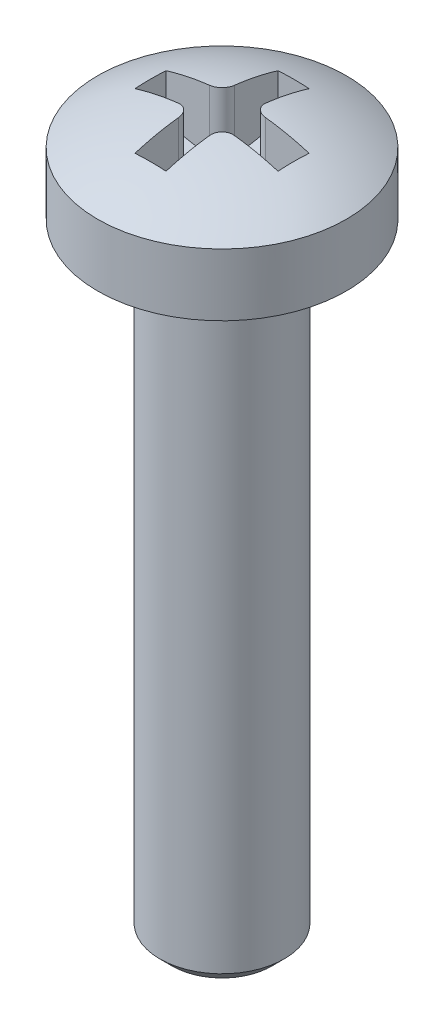
ISO-10303-21;
HEADER;
FILE_DESCRIPTION(('STEP AP214'),'2;1');
FILE_NAME('part.step','',(''),(''),'','','');
FILE_SCHEMA(('AUTOMOTIVE_DESIGN { 1 0 10303 214 1 1 1 1 }'));
ENDSEC;
DATA;
#1=APPLICATION_CONTEXT('core data for automotive mechanical design processes');
#2=APPLICATION_PROTOCOL_DEFINITION('international standard','automotive_design',2000,#1);
#3=PRODUCT_CONTEXT('',#1,'mechanical');
#4=PRODUCT('Part','Part','',(#3));
#5=PRODUCT_RELATED_PRODUCT_CATEGORY('part','',(#4));
#6=PRODUCT_DEFINITION_FORMATION('','',#4);
#7=PRODUCT_DEFINITION_CONTEXT('part definition',#1,'design');
#8=PRODUCT_DEFINITION('design','',#6,#7);
#9=PRODUCT_DEFINITION_SHAPE('','',#8);
#10=(LENGTH_UNIT() NAMED_UNIT(*) SI_UNIT(.MILLI.,.METRE.));
#11=(NAMED_UNIT(*) PLANE_ANGLE_UNIT() SI_UNIT($,.RADIAN.));
#12=(NAMED_UNIT(*) SI_UNIT($,.STERADIAN.) SOLID_ANGLE_UNIT());
#13=UNCERTAINTY_MEASURE_WITH_UNIT(LENGTH_MEASURE(1.E-05),#10,'distance_accuracy_value','');
#14=(GEOMETRIC_REPRESENTATION_CONTEXT(3) GLOBAL_UNCERTAINTY_ASSIGNED_CONTEXT((#13)) GLOBAL_UNIT_ASSIGNED_CONTEXT((#10,
#11,#12)) REPRESENTATION_CONTEXT('',''));
#15=CARTESIAN_POINT('',(0.,0.,0.));
#16=DIRECTION('',(0.,0.,1.));
#17=DIRECTION('',(1.,0.,0.));
#18=AXIS2_PLACEMENT_3D('',#15,#16,#17);
#19=CARTESIAN_POINT('',(2.,-20.,0.));
#20=DIRECTION('',(0.,1.,0.));
#21=DIRECTION('',(0.,0.,1.));
#22=AXIS2_PLACEMENT_3D('',#19,#20,#21);
#23=PLANE('',#22);
#24=CARTESIAN_POINT('',(0.,-20.,0.));
#25=DIRECTION('',(0.,1.,0.));
#26=DIRECTION('',(0.,0.,1.));
#27=AXIS2_PLACEMENT_3D('',#24,#25,#26);
#28=CIRCLE('',#27,1.6);
#29=CARTESIAN_POINT('',(0.,-20.,1.6));
#30=VERTEX_POINT('',#29);
#31=EDGE_CURVE('E11',#30,#30,#28,.F.);
#32=ORIENTED_EDGE('',*,*,#31,.T.);
#33=EDGE_LOOP('',(#32));
#34=FACE_BOUND('',#33,.T.);
#35=ADVANCED_FACE('F37',(#34),#23,.F.);
#36=CARTESIAN_POINT('',(0.,-4.72272727272728,0.));
#37=DIRECTION('',(0.,1.,0.));
#38=DIRECTION('',(1.,0.,0.));
#39=AXIS2_PLACEMENT_3D('',#36,#37,#38);
#40=SPHERICAL_SURFACE('',#39,7.82272727272728);
#41=CARTESIAN_POINT('',(0.5,-4.72272727272728,0.));
#42=DIRECTION('',(1.,0.,0.));
#43=DIRECTION('',(0.,0.,-1.));
#44=AXIS2_PLACEMENT_3D('',#41,#42,#43);
#45=CIRCLE('',#44,7.80673183755348);
#46=CARTESIAN_POINT('',(0.5,2.73750476008987,-2.3));
#47=VERTEX_POINT('',#46);
#48=CARTESIAN_POINT('',(0.5,3.03195273249996,-0.9));
#49=VERTEX_POINT('',#48);
#50=EDGE_CURVE('E195',#47,#49,#45,.T.);
#51=ORIENTED_EDGE('',*,*,#50,.T.);
#52=CARTESIAN_POINT('',(0.5,3.03195273249996,-0.9));
#53=CARTESIAN_POINT('',(0.499980445653111,3.03454133641409,-0.877715199489853));
#54=CARTESIAN_POINT('',(0.501861325410847,3.0369109081898,-0.855406290685576));
#55=CARTESIAN_POINT('',(0.509308944557218,3.04115309750786,-0.811373363194762));
#56=CARTESIAN_POINT('',(0.514874142284133,3.04302592244948,-0.789649103823202));
#57=CARTESIAN_POINT('',(0.529581237998282,3.04621922226135,-0.747382590966706));
#58=CARTESIAN_POINT('',(0.538725894104163,3.0475392695665,-0.726841263013532));
#59=CARTESIAN_POINT('',(0.560335395409864,3.04958563422558,-0.687561895208892));
#60=CARTESIAN_POINT('',(0.572799188800053,3.05031213937239,-0.668823286645484));
#61=CARTESIAN_POINT('',(0.600596407799792,3.05114682561896,-0.633816736919395));
#62=CARTESIAN_POINT('',(0.615908512897499,3.05125942358876,-0.617531968951503));
#63=CARTESIAN_POINT('',(0.649026593510928,3.0508747494218,-0.587736528915892));
#64=CARTESIAN_POINT('',(0.666832948845617,3.05037738431157,-0.57422628012003));
#65=CARTESIAN_POINT('',(0.704363578386314,3.04879030089852,-0.550401537052683));
#66=CARTESIAN_POINT('',(0.724081674108829,3.04770244181268,-0.540077170971166));
#67=CARTESIAN_POINT('',(0.764919862434989,3.04496752601447,-0.522847557382613));
#68=CARTESIAN_POINT('',(0.786039420133905,3.04332068167708,-0.515941013789886));
#69=CARTESIAN_POINT('',(0.822714805755103,3.04007942212771,-0.5072274099574));
#70=CARTESIAN_POINT('',(0.838074093965798,3.03861284502167,-0.504517057384848));
#71=CARTESIAN_POINT('',(0.868957976534767,3.0354499847468,-0.500903202638105));
#72=CARTESIAN_POINT('',(0.88448230264661,3.03375403356009,-0.499997118337815));
#73=CARTESIAN_POINT('',(0.9,3.03195273249996,-0.5));
#74=B_SPLINE_CURVE_WITH_KNOTS('',3,(#52,#53,#54,#55,#56,#57,#58,#59,#60,#61,#62,#63,#64,#65,#66,
#67,#68,#69,#70,#71,#72,#73),.UNSPECIFIED.,.F.,.F.,(4,2,2,2,2,2,2,2,2,2,4),(0.,
0.0672224170043276,0.134416723302517,0.201662907801201,0.26888780779591,0.335628401088124,
0.402379168562592,0.468920974876219,0.535437528240593,0.582332561709017,0.629160434341086),.UNSPECIFIED.);
#75=CARTESIAN_POINT('',(0.9,3.03195273249996,-0.5));
#76=VERTEX_POINT('',#75);
#77=EDGE_CURVE('E257',#49,#76,#74,.T.);
#78=ORIENTED_EDGE('',*,*,#77,.T.);
#79=CARTESIAN_POINT('',(0.,-4.72272727272728,-0.5));
#80=DIRECTION('',(0.,0.,-1.));
#81=DIRECTION('',(-1.,0.,0.));
#82=AXIS2_PLACEMENT_3D('',#79,#80,#81);
#83=CIRCLE('',#82,7.80673183755348);
#84=CARTESIAN_POINT('',(2.3,2.73750476008987,-0.5));
#85=VERTEX_POINT('',#84);
#86=EDGE_CURVE('E193',#76,#85,#83,.T.);
#87=ORIENTED_EDGE('',*,*,#86,.T.);
#88=CARTESIAN_POINT('',(2.3,-4.72272727272728,0.));
#89=DIRECTION('',(1.,0.,0.));
#90=DIRECTION('',(0.,0.,-1.));
#91=AXIS2_PLACEMENT_3D('',#88,#89,#90);
#92=CIRCLE('',#91,7.47696876972688);
#93=CARTESIAN_POINT('',(2.3,2.73750476008987,0.5));
#94=VERTEX_POINT('',#93);
#95=EDGE_CURVE('E170',#85,#94,#92,.T.);
#96=ORIENTED_EDGE('',*,*,#95,.T.);
#97=CARTESIAN_POINT('',(0.,-4.72272727272728,0.5));
#98=DIRECTION('',(0.,0.,1.));
#99=DIRECTION('',(1.,0.,0.));
#100=AXIS2_PLACEMENT_3D('',#97,#98,#99);
#101=CIRCLE('',#100,7.80673183755348);
#102=CARTESIAN_POINT('',(0.9,3.03195273249996,0.5));
#103=VERTEX_POINT('',#102);
#104=EDGE_CURVE('E219',#94,#103,#101,.T.);
#105=ORIENTED_EDGE('',*,*,#104,.T.);
#106=CARTESIAN_POINT('',(0.9,3.03195273249996,0.5));
#107=CARTESIAN_POINT('',(0.877715199489853,3.03454133641409,0.499980445653111));
#108=CARTESIAN_POINT('',(0.855406290685576,3.0369109081898,0.501861325410847));
#109=CARTESIAN_POINT('',(0.811373363194762,3.04115309750786,0.509308944557218));
#110=CARTESIAN_POINT('',(0.789649103823202,3.04302592244948,0.514874142284133));
#111=CARTESIAN_POINT('',(0.747382590966706,3.04621922226135,0.529581237998282));
#112=CARTESIAN_POINT('',(0.726841263013532,3.0475392695665,0.538725894104163));
#113=CARTESIAN_POINT('',(0.687561895208891,3.04958563422558,0.560335395409864));
#114=CARTESIAN_POINT('',(0.668823286645484,3.05031213937239,0.572799188800053));
#115=CARTESIAN_POINT('',(0.633816736919395,3.05114682561896,0.600596407799792));
#116=CARTESIAN_POINT('',(0.617531968951503,3.05125942358877,0.6159085128975));
#117=CARTESIAN_POINT('',(0.587736528915892,3.0508747494218,0.649026593510929));
#118=CARTESIAN_POINT('',(0.57422628012003,3.05037738431157,0.666832948845617));
#119=CARTESIAN_POINT('',(0.550401537052683,3.04879030089852,0.704363578386314));
#120=CARTESIAN_POINT('',(0.540077170971166,3.04770244181268,0.724081674108829));
#121=CARTESIAN_POINT('',(0.522847557382613,3.04496752601447,0.764919862434989));
#122=CARTESIAN_POINT('',(0.515941013789886,3.04332068167708,0.786039420133905));
#123=CARTESIAN_POINT('',(0.5072274099574,3.04007942212771,0.822714805755103));
#124=CARTESIAN_POINT('',(0.504517057384848,3.03861284502167,0.838074093965798));
#125=CARTESIAN_POINT('',(0.500903202638105,3.03544998474679,0.868957976534767));
#126=CARTESIAN_POINT('',(0.499997118337815,3.03375403356009,0.884482302646609));
#127=CARTESIAN_POINT('',(0.5,3.03195273249996,0.9));
#128=B_SPLINE_CURVE_WITH_KNOTS('',3,(#106,#107,#108,#109,#110,#111,#112,#113,#114,#115,#116,
#117,#118,#119,#120,#121,#122,#123,#124,#125,#126,#127),.UNSPECIFIED.,.F.,.F.,(4,2,2,2,2,2,2,2,
2,2,4),(0.,0.0672224170043276,0.134416723302517,0.201662907801201,0.268887807795911,
0.335628401088124,0.402379168562592,0.468920974876219,0.535437528240593,0.582332561709017,
0.629160434341086),.UNSPECIFIED.);
#129=CARTESIAN_POINT('',(0.5,3.03195273249996,0.9));
#130=VERTEX_POINT('',#129);
#131=EDGE_CURVE('E252',#103,#130,#128,.T.);
#132=ORIENTED_EDGE('',*,*,#131,.T.);
#133=CARTESIAN_POINT('',(0.5,-4.72272727272728,0.));
#134=DIRECTION('',(1.,0.,0.));
#135=DIRECTION('',(0.,0.,-1.));
#136=AXIS2_PLACEMENT_3D('',#133,#134,#135);
#137=CIRCLE('',#136,7.80673183755348);
#138=CARTESIAN_POINT('',(0.5,2.73750476008987,2.3));
#139=VERTEX_POINT('',#138);
#140=EDGE_CURVE('E217',#130,#139,#137,.T.);
#141=ORIENTED_EDGE('',*,*,#140,.T.);
#142=CARTESIAN_POINT('',(0.,-4.72272727272728,2.3));
#143=DIRECTION('',(0.,0.,1.));
#144=DIRECTION('',(1.,0.,0.));
#145=AXIS2_PLACEMENT_3D('',#142,#143,#144);
#146=CIRCLE('',#145,7.47696876972688);
#147=CARTESIAN_POINT('',(-0.5,2.73750476008987,2.3));
#148=VERTEX_POINT('',#147);
#149=EDGE_CURVE('E214',#139,#148,#146,.T.);
#150=ORIENTED_EDGE('',*,*,#149,.T.);
#151=CARTESIAN_POINT('',(-0.5,-4.72272727272728,0.));
#152=DIRECTION('',(-1.,0.,0.));
#153=DIRECTION('',(0.,0.,1.));
#154=AXIS2_PLACEMENT_3D('',#151,#152,#153);
#155=CIRCLE('',#154,7.80673183755348);
#156=CARTESIAN_POINT('',(-0.5,3.03195273249996,0.9));
#157=VERTEX_POINT('',#156);
#158=EDGE_CURVE('E211',#148,#157,#155,.T.);
#159=ORIENTED_EDGE('',*,*,#158,.T.);
#160=CARTESIAN_POINT('',(-0.5,3.03195273249996,0.9));
#161=CARTESIAN_POINT('',(-0.499980445653111,3.03454133641409,0.877715199489853));
#162=CARTESIAN_POINT('',(-0.501861325410847,3.0369109081898,0.855406290685576));
#163=CARTESIAN_POINT('',(-0.509308944557218,3.04115309750786,0.811373363194762));
#164=CARTESIAN_POINT('',(-0.514874142284133,3.04302592244948,0.789649103823202));
#165=CARTESIAN_POINT('',(-0.529581237998282,3.04621922226135,0.747382590966706));
#166=CARTESIAN_POINT('',(-0.538725894104163,3.0475392695665,0.726841263013532));
#167=CARTESIAN_POINT('',(-0.560335395409864,3.04958563422558,0.687561895208892));
#168=CARTESIAN_POINT('',(-0.572799188800053,3.05031213937239,0.668823286645484));
#169=CARTESIAN_POINT('',(-0.600596407799792,3.05114682561896,0.633816736919395));
#170=CARTESIAN_POINT('',(-0.6159085128975,3.05125942358876,0.617531968951503));
#171=CARTESIAN_POINT('',(-0.649026593510929,3.0508747494218,0.587736528915892));
#172=CARTESIAN_POINT('',(-0.666832948845617,3.05037738431157,0.57422628012003));
#173=CARTESIAN_POINT('',(-0.704363578386314,3.04879030089852,0.550401537052683));
#174=CARTESIAN_POINT('',(-0.724081674108829,3.04770244181268,0.540077170971166));
#175=CARTESIAN_POINT('',(-0.764919862434989,3.04496752601447,0.522847557382613));
#176=CARTESIAN_POINT('',(-0.786039420133905,3.04332068167708,0.515941013789887));
#177=CARTESIAN_POINT('',(-0.822714805755103,3.04007942212771,0.5072274099574));
#178=CARTESIAN_POINT('',(-0.838074093965798,3.03861284502167,0.504517057384848));
#179=CARTESIAN_POINT('',(-0.868957976534767,3.0354499847468,0.500903202638105));
#180=CARTESIAN_POINT('',(-0.88448230264661,3.03375403356009,0.499997118337815));
#181=CARTESIAN_POINT('',(-0.9,3.03195273249996,0.5));
#182=B_SPLINE_CURVE_WITH_KNOTS('',3,(#160,#161,#162,#163,#164,#165,#166,#167,#168,#169,#170,
#171,#172,#173,#174,#175,#176,#177,#178,#179,#180,#181),.UNSPECIFIED.,.F.,.F.,(4,2,2,2,2,2,2,2,
2,2,4),(0.,0.0672224170043276,0.134416723302517,0.201662907801201,0.26888780779591,
0.335628401088124,0.402379168562592,0.468920974876219,0.535437528240592,0.582332561709017,
0.629160434341086),.UNSPECIFIED.);
#183=CARTESIAN_POINT('',(-0.9,3.03195273249996,0.5));
#184=VERTEX_POINT('',#183);
#185=EDGE_CURVE('E231',#157,#184,#182,.T.);
#186=ORIENTED_EDGE('',*,*,#185,.T.);
#187=CARTESIAN_POINT('',(0.,-4.72272727272728,0.5));
#188=DIRECTION('',(0.,0.,1.));
#189=DIRECTION('',(1.,0.,0.));
#190=AXIS2_PLACEMENT_3D('',#187,#188,#189);
#191=CIRCLE('',#190,7.80673183755348);
#192=CARTESIAN_POINT('',(-2.3,2.73750476008987,0.5));
#193=VERTEX_POINT('',#192);
#194=EDGE_CURVE('E209',#184,#193,#191,.T.);
#195=ORIENTED_EDGE('',*,*,#194,.T.);
#196=CARTESIAN_POINT('',(-2.3,-4.72272727272728,0.));
#197=DIRECTION('',(-1.,0.,0.));
#198=DIRECTION('',(0.,0.,1.));
#199=AXIS2_PLACEMENT_3D('',#196,#197,#198);
#200=CIRCLE('',#199,7.47696876972688);
#201=CARTESIAN_POINT('',(-2.3,2.73750476008987,-0.5));
#202=VERTEX_POINT('',#201);
#203=EDGE_CURVE('E206',#193,#202,#200,.T.);
#204=ORIENTED_EDGE('',*,*,#203,.T.);
#205=CARTESIAN_POINT('',(0.,-4.72272727272728,-0.5));
#206=DIRECTION('',(0.,0.,-1.));
#207=DIRECTION('',(-1.,0.,0.));
#208=AXIS2_PLACEMENT_3D('',#205,#206,#207);
#209=CIRCLE('',#208,7.80673183755348);
#210=CARTESIAN_POINT('',(-0.9,3.03195273249996,-0.5));
#211=VERTEX_POINT('',#210);
#212=EDGE_CURVE('E203',#202,#211,#209,.T.);
#213=ORIENTED_EDGE('',*,*,#212,.T.);
#214=CARTESIAN_POINT('',(-0.9,3.03195273249996,-0.5));
#215=CARTESIAN_POINT('',(-0.877715199489853,3.03454133641409,-0.499980445653111));
#216=CARTESIAN_POINT('',(-0.855406290685576,3.0369109081898,-0.501861325410847));
#217=CARTESIAN_POINT('',(-0.811373363194762,3.04115309750786,-0.509308944557218));
#218=CARTESIAN_POINT('',(-0.789649103823202,3.04302592244948,-0.514874142284133));
#219=CARTESIAN_POINT('',(-0.747382590966706,3.04621922226135,-0.529581237998282));
#220=CARTESIAN_POINT('',(-0.726841263013532,3.0475392695665,-0.538725894104163));
#221=CARTESIAN_POINT('',(-0.687561895208892,3.04958563422558,-0.560335395409864));
#222=CARTESIAN_POINT('',(-0.668823286645484,3.05031213937239,-0.572799188800053));
#223=CARTESIAN_POINT('',(-0.633816736919395,3.05114682561896,-0.600596407799792));
#224=CARTESIAN_POINT('',(-0.617531968951503,3.05125942358877,-0.6159085128975));
#225=CARTESIAN_POINT('',(-0.587736528915892,3.0508747494218,-0.649026593510929));
#226=CARTESIAN_POINT('',(-0.57422628012003,3.05037738431157,-0.666832948845617));
#227=CARTESIAN_POINT('',(-0.550401537052683,3.04879030089852,-0.704363578386314));
#228=CARTESIAN_POINT('',(-0.540077170971166,3.04770244181268,-0.724081674108829));
#229=CARTESIAN_POINT('',(-0.522847557382613,3.04496752601447,-0.764919862434989));
#230=CARTESIAN_POINT('',(-0.515941013789887,3.04332068167708,-0.786039420133905));
#231=CARTESIAN_POINT('',(-0.5072274099574,3.04007942212771,-0.822714805755103));
#232=CARTESIAN_POINT('',(-0.504517057384848,3.03861284502167,-0.838074093965798));
#233=CARTESIAN_POINT('',(-0.500903202638105,3.03544998474679,-0.868957976534767));
#234=CARTESIAN_POINT('',(-0.499997118337815,3.03375403356009,-0.88448230264661));
#235=CARTESIAN_POINT('',(-0.5,3.03195273249996,-0.9));
#236=B_SPLINE_CURVE_WITH_KNOTS('',3,(#214,#215,#216,#217,#218,#219,#220,#221,#222,#223,#224,
#225,#226,#227,#228,#229,#230,#231,#232,#233,#234,#235),.UNSPECIFIED.,.F.,.F.,(4,2,2,2,2,2,2,2,
2,2,4),(0.,0.0672224170043276,0.134416723302517,0.201662907801201,0.268887807795911,
0.335628401088124,0.402379168562592,0.468920974876219,0.535437528240593,0.582332561709018,
0.629160434341086),.UNSPECIFIED.);
#237=CARTESIAN_POINT('',(-0.5,3.03195273249996,-0.9));
#238=VERTEX_POINT('',#237);
#239=EDGE_CURVE('E225',#211,#238,#236,.T.);
#240=ORIENTED_EDGE('',*,*,#239,.T.);
#241=CARTESIAN_POINT('',(-0.5,-4.72272727272728,0.));
#242=DIRECTION('',(-1.,0.,0.));
#243=DIRECTION('',(0.,0.,1.));
#244=AXIS2_PLACEMENT_3D('',#241,#242,#243);
#245=CIRCLE('',#244,7.80673183755348);
#246=CARTESIAN_POINT('',(-0.5,2.73750476008987,-2.3));
#247=VERTEX_POINT('',#246);
#248=EDGE_CURVE('E201',#238,#247,#245,.T.);
#249=ORIENTED_EDGE('',*,*,#248,.T.);
#250=CARTESIAN_POINT('',(0.,-4.72272727272728,-2.3));
#251=DIRECTION('',(0.,0.,-1.));
#252=DIRECTION('',(-1.,0.,0.));
#253=AXIS2_PLACEMENT_3D('',#250,#251,#252);
#254=CIRCLE('',#253,7.47696876972688);
#255=EDGE_CURVE('E198',#247,#47,#254,.T.);
#256=ORIENTED_EDGE('',*,*,#255,.T.);
#257=EDGE_LOOP('',(#51,#78,#87,#96,#105,#132,#141,#150,#159,#186,#195,#204,#213,#240,#249,#256));
#258=FACE_BOUND('',#257,.T.);
#259=CARTESIAN_POINT('',(0.,2.,0.));
#260=DIRECTION('',(0.,1.,0.));
#261=DIRECTION('',(0.,0.,1.));
#262=AXIS2_PLACEMENT_3D('',#259,#260,#261);
#263=CIRCLE('',#262,4.);
#264=CARTESIAN_POINT('',(0.,2.,4.));
#265=VERTEX_POINT('',#264);
#266=EDGE_CURVE('E189',#265,#265,#263,.T.);
#267=ORIENTED_EDGE('',*,*,#266,.T.);
#268=EDGE_LOOP('',(#267));
#269=FACE_BOUND('',#268,.T.);
#270=ADVANCED_FACE('F239',(#258,#269),#40,.T.);
#271=CARTESIAN_POINT('',(0.,3.1,0.));
#272=DIRECTION('',(0.,1.,0.));
#273=DIRECTION('',(0.,0.,1.));
#274=AXIS2_PLACEMENT_3D('',#271,#272,#273);
#275=CYLINDRICAL_SURFACE('',#274,4.);
#276=ORIENTED_EDGE('',*,*,#266,.F.);
#277=EDGE_LOOP('',(#276));
#278=FACE_BOUND('',#277,.T.);
#279=CARTESIAN_POINT('',(0.,0.,0.));
#280=DIRECTION('',(0.,1.,0.));
#281=DIRECTION('',(0.,0.,1.));
#282=AXIS2_PLACEMENT_3D('',#279,#280,#281);
#283=CIRCLE('',#282,4.);
#284=CARTESIAN_POINT('',(0.,0.,4.));
#285=VERTEX_POINT('',#284);
#286=EDGE_CURVE('E181',#285,#285,#283,.T.);
#287=ORIENTED_EDGE('',*,*,#286,.T.);
#288=EDGE_LOOP('',(#287));
#289=FACE_BOUND('',#288,.T.);
#290=ADVANCED_FACE('F244',(#278,#289),#275,.T.);
#291=CARTESIAN_POINT('',(4.,0.,0.));
#292=DIRECTION('',(0.,1.,0.));
#293=DIRECTION('',(0.,0.,1.));
#294=AXIS2_PLACEMENT_3D('',#291,#292,#293);
#295=PLANE('',#294);
#296=ORIENTED_EDGE('',*,*,#286,.F.);
#297=EDGE_LOOP('',(#296));
#298=FACE_BOUND('',#297,.T.);
#299=CARTESIAN_POINT('',(0.,0.,0.));
#300=DIRECTION('',(0.,1.,0.));
#301=DIRECTION('',(0.,0.,1.));
#302=AXIS2_PLACEMENT_3D('',#299,#300,#301);
#303=CIRCLE('',#302,2.);
#304=CARTESIAN_POINT('',(0.,0.,2.));
#305=VERTEX_POINT('',#304);
#306=EDGE_CURVE('E178',#305,#305,#303,.T.);
#307=ORIENTED_EDGE('',*,*,#306,.T.);
#308=EDGE_LOOP('',(#307));
#309=FACE_BOUND('',#308,.T.);
#310=ADVANCED_FACE('F331',(#298,#309),#295,.F.);
#311=CARTESIAN_POINT('',(0.,3.1,0.));
#312=DIRECTION('',(0.,1.,0.));
#313=DIRECTION('',(0.,0.,1.));
#314=AXIS2_PLACEMENT_3D('',#311,#312,#313);
#315=CYLINDRICAL_SURFACE('',#314,2.);
#316=CARTESIAN_POINT('',(0.,-19.6,0.));
#317=DIRECTION('',(0.,1.,0.));
#318=DIRECTION('',(0.,0.,1.));
#319=AXIS2_PLACEMENT_3D('',#316,#317,#318);
#320=CIRCLE('',#319,2.);
#321=CARTESIAN_POINT('',(0.,-19.6,2.));
#322=VERTEX_POINT('',#321);
#323=EDGE_CURVE('E45',#322,#322,#320,.T.);
#324=ORIENTED_EDGE('',*,*,#323,.T.);
#325=EDGE_LOOP('',(#324));
#326=FACE_BOUND('',#325,.T.);
#327=ORIENTED_EDGE('',*,*,#306,.F.);
#328=EDGE_LOOP('',(#327));
#329=FACE_BOUND('',#328,.T.);
#330=ADVANCED_FACE('F303',(#326,#329),#315,.T.);
#331=CARTESIAN_POINT('',(0.5,-20.001,0.5));
#332=DIRECTION('',(0.,0.,1.));
#333=DIRECTION('',(1.,0.,0.));
#334=AXIS2_PLACEMENT_3D('',#331,#332,#333);
#335=PLANE('',#334);
#336=CARTESIAN_POINT('',(0.,9.49999999999998,0.5));
#337=DIRECTION('',(0.,0.,1.));
#338=DIRECTION('',(1.,0.,0.));
#339=AXIS2_PLACEMENT_3D('',#336,#337,#338);
#340=CIRCLE('',#339,8.48528137423855);
#341=CARTESIAN_POINT('',(2.3,1.3323810079069,0.5));
#342=VERTEX_POINT('',#341);
#343=CARTESIAN_POINT('',(0.9,1.06258333374486,0.5));
#344=VERTEX_POINT('',#343);
#345=EDGE_CURVE('E176',#342,#344,#340,.F.);
#346=ORIENTED_EDGE('',*,*,#345,.T.);
#347=DIRECTION('',(0.,1.,0.));
#348=VECTOR('',#347,1.);
#349=CARTESIAN_POINT('',(0.9,-20.001,0.5));
#350=LINE('',#349,#348);
#351=EDGE_CURVE('E556',#344,#103,#350,.T.);
#352=ORIENTED_EDGE('',*,*,#351,.T.);
#353=ORIENTED_EDGE('',*,*,#104,.F.);
#354=DIRECTION('',(0.,1.,0.));
#355=VECTOR('',#354,1.);
#356=CARTESIAN_POINT('',(2.3,-20.001,0.5));
#357=LINE('',#356,#355);
#358=EDGE_CURVE('E172',#342,#94,#357,.T.);
#359=ORIENTED_EDGE('',*,*,#358,.F.);
#360=EDGE_LOOP('',(#346,#352,#353,#359));
#361=FACE_BOUND('',#360,.T.);
#362=ADVANCED_FACE('F344',(#361),#335,.F.);
#363=CARTESIAN_POINT('',(0.5,-20.001,0.5));
#364=DIRECTION('',(1.,0.,0.));
#365=DIRECTION('',(0.,0.,-1.));
#366=AXIS2_PLACEMENT_3D('',#363,#364,#365);
#367=PLANE('',#366);
#368=ORIENTED_EDGE('',*,*,#140,.F.);
#369=DIRECTION('',(0.,1.,0.));
#370=VECTOR('',#369,1.);
#371=CARTESIAN_POINT('',(0.5,-20.001,0.9));
#372=LINE('',#371,#370);
#373=CARTESIAN_POINT('',(0.5,1.06258333374486,0.9));
#374=VERTEX_POINT('',#373);
#375=EDGE_CURVE('E554',#130,#374,#372,.F.);
#376=ORIENTED_EDGE('',*,*,#375,.T.);
#377=CARTESIAN_POINT('',(0.5,9.49999999999998,0.));
#378=DIRECTION('',(1.,0.,0.));
#379=DIRECTION('',(0.,0.,-1.));
#380=AXIS2_PLACEMENT_3D('',#377,#378,#379);
#381=CIRCLE('',#380,8.48528137423855);
#382=CARTESIAN_POINT('',(0.5,1.3323810079069,2.3));
#383=VERTEX_POINT('',#382);
#384=EDGE_CURVE('E183',#374,#383,#381,.F.);
#385=ORIENTED_EDGE('',*,*,#384,.T.);
#386=DIRECTION('',(0.,1.,0.));
#387=VECTOR('',#386,1.);
#388=CARTESIAN_POINT('',(0.5,-20.001,2.3));
#389=LINE('',#388,#387);
#390=EDGE_CURVE('E162',#383,#139,#389,.T.);
#391=ORIENTED_EDGE('',*,*,#390,.T.);
#392=EDGE_LOOP('',(#368,#376,#385,#391));
#393=FACE_BOUND('',#392,.T.);
#394=ADVANCED_FACE('F292',(#393),#367,.F.);
#395=CARTESIAN_POINT('',(-0.5,-20.001,2.3));
#396=DIRECTION('',(0.,0.,1.));
#397=DIRECTION('',(1.,0.,0.));
#398=AXIS2_PLACEMENT_3D('',#395,#396,#397);
#399=PLANE('',#398);
#400=ORIENTED_EDGE('',*,*,#390,.F.);
#401=CARTESIAN_POINT('',(0.,9.49999999999998,2.3));
#402=DIRECTION('',(0.,0.,1.));
#403=DIRECTION('',(1.,0.,0.));
#404=AXIS2_PLACEMENT_3D('',#401,#402,#403);
#405=CIRCLE('',#404,8.18290901819149);
#406=CARTESIAN_POINT('',(-0.5,1.3323810079069,2.3));
#407=VERTEX_POINT('',#406);
#408=EDGE_CURVE('E518',#383,#407,#405,.F.);
#409=ORIENTED_EDGE('',*,*,#408,.T.);
#410=DIRECTION('',(0.,1.,0.));
#411=VECTOR('',#410,1.);
#412=CARTESIAN_POINT('',(-0.5,-20.001,2.3));
#413=LINE('',#412,#411);
#414=EDGE_CURVE('E517',#407,#148,#413,.T.);
#415=ORIENTED_EDGE('',*,*,#414,.T.);
#416=ORIENTED_EDGE('',*,*,#149,.F.);
#417=EDGE_LOOP('',(#400,#409,#415,#416));
#418=FACE_BOUND('',#417,.T.);
#419=ADVANCED_FACE('F357',(#418),#399,.F.);
#420=CARTESIAN_POINT('',(-0.5,-20.001,0.5));
#421=DIRECTION('',(-1.,0.,0.));
#422=DIRECTION('',(0.,0.,1.));
#423=AXIS2_PLACEMENT_3D('',#420,#421,#422);
#424=PLANE('',#423);
#425=CARTESIAN_POINT('',(-0.5,9.49999999999998,0.));
#426=DIRECTION('',(-1.,0.,0.));
#427=DIRECTION('',(0.,0.,1.));
#428=AXIS2_PLACEMENT_3D('',#425,#426,#427);
#429=CIRCLE('',#428,8.48528137423855);
#430=CARTESIAN_POINT('',(-0.5,1.06258333374486,0.9));
#431=VERTEX_POINT('',#430);
#432=EDGE_CURVE('E512',#407,#431,#429,.F.);
#433=ORIENTED_EDGE('',*,*,#432,.T.);
#434=DIRECTION('',(0.,1.,0.));
#435=VECTOR('',#434,1.);
#436=CARTESIAN_POINT('',(-0.5,-20.001,0.9));
#437=LINE('',#436,#435);
#438=EDGE_CURVE('E507',#431,#157,#437,.T.);
#439=ORIENTED_EDGE('',*,*,#438,.T.);
#440=ORIENTED_EDGE('',*,*,#158,.F.);
#441=ORIENTED_EDGE('',*,*,#414,.F.);
#442=EDGE_LOOP('',(#433,#439,#440,#441));
#443=FACE_BOUND('',#442,.T.);
#444=ADVANCED_FACE('F364',(#443),#424,.F.);
#445=CARTESIAN_POINT('',(-2.3,-20.001,0.5));
#446=DIRECTION('',(0.,0.,1.));
#447=DIRECTION('',(1.,0.,0.));
#448=AXIS2_PLACEMENT_3D('',#445,#446,#447);
#449=PLANE('',#448);
#450=ORIENTED_EDGE('',*,*,#194,.F.);
#451=DIRECTION('',(0.,1.,0.));
#452=VECTOR('',#451,1.);
#453=CARTESIAN_POINT('',(-0.9,-20.001,0.5));
#454=LINE('',#453,#452);
#455=CARTESIAN_POINT('',(-0.9,1.06258333374486,0.5));
#456=VERTEX_POINT('',#455);
#457=EDGE_CURVE('E505',#184,#456,#454,.F.);
#458=ORIENTED_EDGE('',*,*,#457,.T.);
#459=CARTESIAN_POINT('',(0.,9.49999999999998,0.5));
#460=DIRECTION('',(0.,0.,1.));
#461=DIRECTION('',(1.,0.,0.));
#462=AXIS2_PLACEMENT_3D('',#459,#460,#461);
#463=CIRCLE('',#462,8.48528137423855);
#464=CARTESIAN_POINT('',(-2.3,1.3323810079069,0.5));
#465=VERTEX_POINT('',#464);
#466=EDGE_CURVE('E515',#456,#465,#463,.F.);
#467=ORIENTED_EDGE('',*,*,#466,.T.);
#468=DIRECTION('',(0.,1.,0.));
#469=VECTOR('',#468,1.);
#470=CARTESIAN_POINT('',(-2.3,-20.001,0.5));
#471=LINE('',#470,#469);
#472=EDGE_CURVE('E529',#465,#193,#471,.T.);
#473=ORIENTED_EDGE('',*,*,#472,.T.);
#474=EDGE_LOOP('',(#450,#458,#467,#473));
#475=FACE_BOUND('',#474,.T.);
#476=ADVANCED_FACE('F371',(#475),#449,.F.);
#477=CARTESIAN_POINT('',(-2.3,-20.001,-0.5));
#478=DIRECTION('',(-1.,0.,0.));
#479=DIRECTION('',(0.,0.,1.));
#480=AXIS2_PLACEMENT_3D('',#477,#478,#479);
#481=PLANE('',#480);
#482=ORIENTED_EDGE('',*,*,#472,.F.);
#483=CARTESIAN_POINT('',(-2.3,9.49999999999998,0.));
#484=DIRECTION('',(-1.,0.,0.));
#485=DIRECTION('',(0.,0.,1.));
#486=AXIS2_PLACEMENT_3D('',#483,#484,#485);
#487=CIRCLE('',#486,8.18290901819149);
#488=CARTESIAN_POINT('',(-2.3,1.3323810079069,-0.5));
#489=VERTEX_POINT('',#488);
#490=EDGE_CURVE('E521',#465,#489,#487,.F.);
#491=ORIENTED_EDGE('',*,*,#490,.T.);
#492=DIRECTION('',(0.,1.,0.));
#493=VECTOR('',#492,1.);
#494=CARTESIAN_POINT('',(-2.3,-20.001,-0.5));
#495=LINE('',#494,#493);
#496=EDGE_CURVE('E532',#489,#202,#495,.T.);
#497=ORIENTED_EDGE('',*,*,#496,.T.);
#498=ORIENTED_EDGE('',*,*,#203,.F.);
#499=EDGE_LOOP('',(#482,#491,#497,#498));
#500=FACE_BOUND('',#499,.T.);
#501=ADVANCED_FACE('F379',(#500),#481,.F.);
#502=CARTESIAN_POINT('',(-2.3,-20.001,-0.5));
#503=DIRECTION('',(0.,0.,-1.));
#504=DIRECTION('',(-1.,0.,0.));
#505=AXIS2_PLACEMENT_3D('',#502,#503,#504);
#506=PLANE('',#505);
#507=CARTESIAN_POINT('',(0.,9.49999999999998,-0.5));
#508=DIRECTION('',(0.,0.,-1.));
#509=DIRECTION('',(-1.,0.,0.));
#510=AXIS2_PLACEMENT_3D('',#507,#508,#509);
#511=CIRCLE('',#510,8.48528137423855);
#512=CARTESIAN_POINT('',(-0.9,1.06258333374486,-0.5));
#513=VERTEX_POINT('',#512);
#514=EDGE_CURVE('E564',#489,#513,#511,.F.);
#515=ORIENTED_EDGE('',*,*,#514,.T.);
#516=DIRECTION('',(0.,1.,0.));
#517=VECTOR('',#516,1.);
#518=CARTESIAN_POINT('',(-0.9,-20.001,-0.5));
#519=LINE('',#518,#517);
#520=EDGE_CURVE('E549',#513,#211,#519,.T.);
#521=ORIENTED_EDGE('',*,*,#520,.T.);
#522=ORIENTED_EDGE('',*,*,#212,.F.);
#523=ORIENTED_EDGE('',*,*,#496,.F.);
#524=EDGE_LOOP('',(#515,#521,#522,#523));
#525=FACE_BOUND('',#524,.T.);
#526=ADVANCED_FACE('F387',(#525),#506,.F.);
#527=CARTESIAN_POINT('',(-0.5,-20.001,-2.3));
#528=DIRECTION('',(-1.,0.,0.));
#529=DIRECTION('',(0.,0.,1.));
#530=AXIS2_PLACEMENT_3D('',#527,#528,#529);
#531=PLANE('',#530);
#532=ORIENTED_EDGE('',*,*,#248,.F.);
#533=DIRECTION('',(0.,1.,0.));
#534=VECTOR('',#533,1.);
#535=CARTESIAN_POINT('',(-0.5,-20.001,-0.9));
#536=LINE('',#535,#534);
#537=CARTESIAN_POINT('',(-0.5,1.06258333374486,-0.9));
#538=VERTEX_POINT('',#537);
#539=EDGE_CURVE('E52',#238,#538,#536,.F.);
#540=ORIENTED_EDGE('',*,*,#539,.T.);
#541=CARTESIAN_POINT('',(-0.5,9.49999999999998,0.));
#542=DIRECTION('',(-1.,0.,0.));
#543=DIRECTION('',(0.,0.,1.));
#544=AXIS2_PLACEMENT_3D('',#541,#542,#543);
#545=CIRCLE('',#544,8.48528137423855);
#546=CARTESIAN_POINT('',(-0.5,1.3323810079069,-2.3));
#547=VERTEX_POINT('',#546);
#548=EDGE_CURVE('E560',#538,#547,#545,.F.);
#549=ORIENTED_EDGE('',*,*,#548,.T.);
#550=DIRECTION('',(0.,1.,0.));
#551=VECTOR('',#550,1.);
#552=CARTESIAN_POINT('',(-0.5,-20.001,-2.3));
#553=LINE('',#552,#551);
#554=EDGE_CURVE('E535',#547,#247,#553,.T.);
#555=ORIENTED_EDGE('',*,*,#554,.T.);
#556=EDGE_LOOP('',(#532,#540,#549,#555));
#557=FACE_BOUND('',#556,.T.);
#558=ADVANCED_FACE('F395',(#557),#531,.F.);
#559=CARTESIAN_POINT('',(-0.5,-20.001,-2.3));
#560=DIRECTION('',(0.,0.,-1.));
#561=DIRECTION('',(-1.,0.,0.));
#562=AXIS2_PLACEMENT_3D('',#559,#560,#561);
#563=PLANE('',#562);
#564=ORIENTED_EDGE('',*,*,#554,.F.);
#565=CARTESIAN_POINT('',(0.,9.49999999999998,-2.3));
#566=DIRECTION('',(0.,0.,-1.));
#567=DIRECTION('',(-1.,0.,0.));
#568=AXIS2_PLACEMENT_3D('',#565,#566,#567);
#569=CIRCLE('',#568,8.18290901819149);
#570=CARTESIAN_POINT('',(0.5,1.3323810079069,-2.3));
#571=VERTEX_POINT('',#570);
#572=EDGE_CURVE('E543',#547,#571,#569,.F.);
#573=ORIENTED_EDGE('',*,*,#572,.T.);
#574=DIRECTION('',(0.,1.,0.));
#575=VECTOR('',#574,1.);
#576=CARTESIAN_POINT('',(0.5,-20.001,-2.3));
#577=LINE('',#576,#575);
#578=EDGE_CURVE('E171',#571,#47,#577,.T.);
#579=ORIENTED_EDGE('',*,*,#578,.T.);
#580=ORIENTED_EDGE('',*,*,#255,.F.);
#581=EDGE_LOOP('',(#564,#573,#579,#580));
#582=FACE_BOUND('',#581,.T.);
#583=ADVANCED_FACE('F403',(#582),#563,.F.);
#584=CARTESIAN_POINT('',(0.5,-20.001,-2.3));
#585=DIRECTION('',(1.,0.,0.));
#586=DIRECTION('',(0.,0.,-1.));
#587=AXIS2_PLACEMENT_3D('',#584,#585,#586);
#588=PLANE('',#587);
#589=CARTESIAN_POINT('',(0.5,9.49999999999998,0.));
#590=DIRECTION('',(1.,0.,0.));
#591=DIRECTION('',(0.,0.,-1.));
#592=AXIS2_PLACEMENT_3D('',#589,#590,#591);
#593=CIRCLE('',#592,8.48528137423855);
#594=CARTESIAN_POINT('',(0.5,1.06258333374486,-0.9));
#595=VERTEX_POINT('',#594);
#596=EDGE_CURVE('E161',#571,#595,#593,.F.);
#597=ORIENTED_EDGE('',*,*,#596,.T.);
#598=DIRECTION('',(0.,1.,0.));
#599=VECTOR('',#598,1.);
#600=CARTESIAN_POINT('',(0.5,-20.001,-0.9));
#601=LINE('',#600,#599);
#602=EDGE_CURVE('E222',#595,#49,#601,.T.);
#603=ORIENTED_EDGE('',*,*,#602,.T.);
#604=ORIENTED_EDGE('',*,*,#50,.F.);
#605=ORIENTED_EDGE('',*,*,#578,.F.);
#606=EDGE_LOOP('',(#597,#603,#604,#605));
#607=FACE_BOUND('',#606,.T.);
#608=ADVANCED_FACE('F410',(#607),#588,.F.);
#609=CARTESIAN_POINT('',(0.5,-20.001,-0.5));
#610=DIRECTION('',(0.,0.,-1.));
#611=DIRECTION('',(-1.,0.,0.));
#612=AXIS2_PLACEMENT_3D('',#609,#610,#611);
#613=PLANE('',#612);
#614=ORIENTED_EDGE('',*,*,#86,.F.);
#615=DIRECTION('',(0.,1.,0.));
#616=VECTOR('',#615,1.);
#617=CARTESIAN_POINT('',(0.9,-20.001,-0.5));
#618=LINE('',#617,#616);
#619=CARTESIAN_POINT('',(0.9,1.06258333374486,-0.5));
#620=VERTEX_POINT('',#619);
#621=EDGE_CURVE('E158',#76,#620,#618,.F.);
#622=ORIENTED_EDGE('',*,*,#621,.T.);
#623=CARTESIAN_POINT('',(0.,9.49999999999998,-0.5));
#624=DIRECTION('',(0.,0.,-1.));
#625=DIRECTION('',(-1.,0.,0.));
#626=AXIS2_PLACEMENT_3D('',#623,#624,#625);
#627=CIRCLE('',#626,8.48528137423855);
#628=CARTESIAN_POINT('',(2.3,1.3323810079069,-0.5));
#629=VERTEX_POINT('',#628);
#630=EDGE_CURVE('E152',#620,#629,#627,.F.);
#631=ORIENTED_EDGE('',*,*,#630,.T.);
#632=DIRECTION('',(0.,1.,0.));
#633=VECTOR('',#632,1.);
#634=CARTESIAN_POINT('',(2.3,-20.001,-0.5));
#635=LINE('',#634,#633);
#636=EDGE_CURVE('E156',#629,#85,#635,.T.);
#637=ORIENTED_EDGE('',*,*,#636,.T.);
#638=EDGE_LOOP('',(#614,#622,#631,#637));
#639=FACE_BOUND('',#638,.T.);
#640=ADVANCED_FACE('F155',(#639),#613,.F.);
#641=CARTESIAN_POINT('',(2.3,-20.001,-0.5));
#642=DIRECTION('',(1.,0.,0.));
#643=DIRECTION('',(0.,0.,-1.));
#644=AXIS2_PLACEMENT_3D('',#641,#642,#643);
#645=PLANE('',#644);
#646=ORIENTED_EDGE('',*,*,#636,.F.);
#647=CARTESIAN_POINT('',(2.3,9.49999999999998,0.));
#648=DIRECTION('',(1.,0.,0.));
#649=DIRECTION('',(0.,0.,-1.));
#650=AXIS2_PLACEMENT_3D('',#647,#648,#649);
#651=CIRCLE('',#650,8.18290901819149);
#652=EDGE_CURVE('E167',#629,#342,#651,.F.);
#653=ORIENTED_EDGE('',*,*,#652,.T.);
#654=ORIENTED_EDGE('',*,*,#358,.T.);
#655=ORIENTED_EDGE('',*,*,#95,.F.);
#656=EDGE_LOOP('',(#646,#653,#654,#655));
#657=FACE_BOUND('',#656,.T.);
#658=ADVANCED_FACE('F166',(#657),#645,.F.);
#659=CARTESIAN_POINT('',(0.,9.49999999999998,0.));
#660=DIRECTION('',(0.,1.,0.));
#661=DIRECTION('',(1.,0.,0.));
#662=AXIS2_PLACEMENT_3D('',#659,#660,#661);
#663=SPHERICAL_SURFACE('',#662,8.49999999999998);
#664=ORIENTED_EDGE('',*,*,#345,.F.);
#665=ORIENTED_EDGE('',*,*,#652,.F.);
#666=ORIENTED_EDGE('',*,*,#630,.F.);
#667=CARTESIAN_POINT('',(0.9,1.06258333374486,-0.5));
#668=CARTESIAN_POINT('',(0.877681895176581,1.06020064583187,-0.499980506377996));
#669=CARTESIAN_POINT('',(0.855344205727362,1.0580201488652,-0.501866869905914));
#670=CARTESIAN_POINT('',(0.811264196369215,1.05411756501269,-0.509332340473144));
#671=CARTESIAN_POINT('',(0.78952159882242,1.05239526097159,-0.514909693823375));
#672=CARTESIAN_POINT('',(0.747228556255667,1.04945966047884,-0.529643735623788));
#673=CARTESIAN_POINT('',(0.726678990033897,1.04824673524169,-0.538803025087882));
#674=CARTESIAN_POINT('',(0.687389852539137,1.04636746374655,-0.560442280349619));
#675=CARTESIAN_POINT('',(0.668649749482246,1.04570095646757,-0.572921266446781));
#676=CARTESIAN_POINT('',(0.633625729643449,1.04493649451643,-0.600763861630353));
#677=CARTESIAN_POINT('',(0.617327507926939,1.04483509156346,-0.616109383561911));
#678=CARTESIAN_POINT('',(0.587514637710959,1.04519463942213,-0.649299998886555));
#679=CARTESIAN_POINT('',(0.574000432084661,1.04565567962496,-0.667145489209941));
#680=CARTESIAN_POINT('',(0.55017165377276,1.04712438551599,-0.704769667803527));
#681=CARTESIAN_POINT('',(0.539848822620757,1.04813062146146,-0.724543189195622));
#682=CARTESIAN_POINT('',(0.522637980126425,1.05065941614313,-0.765498290560969));
#683=CARTESIAN_POINT('',(0.515748559609182,1.05218176262027,-0.78667928881133));
#684=CARTESIAN_POINT('',(0.507116958212197,1.05516459963325,-0.823303350164225));
#685=CARTESIAN_POINT('',(0.504448298653858,1.05650461680506,-0.838544928463922));
#686=CARTESIAN_POINT('',(0.500889732891837,1.05939256924764,-0.869192646434852));
#687=CARTESIAN_POINT('',(0.499997287547255,1.06094020433808,-0.884598519500552));
#688=CARTESIAN_POINT('',(0.5,1.06258333374486,-0.9));
#689=B_SPLINE_CURVE_WITH_KNOTS('',3,(#667,#668,#669,#670,#671,#672,#673,#674,#675,#676,#677,
#678,#679,#680,#681,#682,#683,#684,#685,#686,#687,#688),.UNSPECIFIED.,.F.,.F.,(4,2,2,2,2,2,2,2,
2,2,4),(0.,0.0672520458092346,0.134472161271656,0.201741179358209,0.268990367163335,
0.33582874565086,0.402677748396607,0.469352286257207,0.535999436300152,0.582495090258099,
0.628924229684279),.UNSPECIFIED.);
#690=EDGE_CURVE('E280',#620,#595,#689,.T.);
#691=ORIENTED_EDGE('',*,*,#690,.T.);
#692=ORIENTED_EDGE('',*,*,#596,.F.);
#693=ORIENTED_EDGE('',*,*,#572,.F.);
#694=ORIENTED_EDGE('',*,*,#548,.F.);
#695=CARTESIAN_POINT('',(-0.5,1.06258333374486,-0.9));
#696=CARTESIAN_POINT('',(-0.499980506377996,1.06020064583187,-0.877681895176581));
#697=CARTESIAN_POINT('',(-0.501866869905914,1.0580201488652,-0.855344205727362));
#698=CARTESIAN_POINT('',(-0.509332340473144,1.05411756501269,-0.811264196369215));
#699=CARTESIAN_POINT('',(-0.514909693823375,1.05239526097159,-0.789521598822421));
#700=CARTESIAN_POINT('',(-0.529643735623788,1.04945966047884,-0.747228556255667));
#701=CARTESIAN_POINT('',(-0.538803025087882,1.04824673524169,-0.726678990033897));
#702=CARTESIAN_POINT('',(-0.56044228034962,1.04636746374655,-0.687389852539137));
#703=CARTESIAN_POINT('',(-0.572921266446781,1.04570095646757,-0.668649749482246));
#704=CARTESIAN_POINT('',(-0.600763861630353,1.04493649451643,-0.633625729643449));
#705=CARTESIAN_POINT('',(-0.616109383561911,1.04483509156346,-0.617327507926939));
#706=CARTESIAN_POINT('',(-0.649299998886555,1.04519463942213,-0.58751463771096));
#707=CARTESIAN_POINT('',(-0.667145489209941,1.04565567962496,-0.574000432084661));
#708=CARTESIAN_POINT('',(-0.704769667803527,1.04712438551599,-0.550171653772761));
#709=CARTESIAN_POINT('',(-0.724543189195622,1.04813062146146,-0.539848822620758));
#710=CARTESIAN_POINT('',(-0.765498290560969,1.05065941614313,-0.522637980126425));
#711=CARTESIAN_POINT('',(-0.78667928881133,1.05218176262027,-0.515748559609182));
#712=CARTESIAN_POINT('',(-0.823303350164225,1.05516459963325,-0.507116958212197));
#713=CARTESIAN_POINT('',(-0.838544928463922,1.05650461680506,-0.504448298653858));
#714=CARTESIAN_POINT('',(-0.869192646434852,1.05939256924764,-0.500889732891837));
#715=CARTESIAN_POINT('',(-0.884598519500552,1.06094020433808,-0.499997287547255));
#716=CARTESIAN_POINT('',(-0.9,1.06258333374486,-0.5));
#717=B_SPLINE_CURVE_WITH_KNOTS('',3,(#695,#696,#697,#698,#699,#700,#701,#702,#703,#704,#705,
#706,#707,#708,#709,#710,#711,#712,#713,#714,#715,#716),.UNSPECIFIED.,.F.,.F.,(4,2,2,2,2,2,2,2,
2,2,4),(0.,0.0672520458092345,0.134472161271656,0.201741179358209,0.268990367163335,
0.33582874565086,0.402677748396607,0.469352286257207,0.535999436300152,0.582495090258099,
0.628924229684279),.UNSPECIFIED.);
#718=EDGE_CURVE('E59',#538,#513,#717,.T.);
#719=ORIENTED_EDGE('',*,*,#718,.T.);
#720=ORIENTED_EDGE('',*,*,#514,.F.);
#721=ORIENTED_EDGE('',*,*,#490,.F.);
#722=ORIENTED_EDGE('',*,*,#466,.F.);
#723=CARTESIAN_POINT('',(-0.9,1.06258333374486,0.5));
#724=CARTESIAN_POINT('',(-0.877681895176581,1.06020064583187,0.499980506377996));
#725=CARTESIAN_POINT('',(-0.855344205727362,1.0580201488652,0.501866869905914));
#726=CARTESIAN_POINT('',(-0.811264196369215,1.05411756501269,0.509332340473144));
#727=CARTESIAN_POINT('',(-0.789521598822421,1.05239526097159,0.514909693823375));
#728=CARTESIAN_POINT('',(-0.747228556255667,1.04945966047884,0.529643735623788));
#729=CARTESIAN_POINT('',(-0.726678990033897,1.04824673524169,0.538803025087882));
#730=CARTESIAN_POINT('',(-0.687389852539138,1.04636746374655,0.560442280349619));
#731=CARTESIAN_POINT('',(-0.668649749482246,1.04570095646757,0.572921266446781));
#732=CARTESIAN_POINT('',(-0.633625729643449,1.04493649451643,0.600763861630353));
#733=CARTESIAN_POINT('',(-0.617327507926939,1.04483509156346,0.616109383561911));
#734=CARTESIAN_POINT('',(-0.58751463771096,1.04519463942213,0.649299998886555));
#735=CARTESIAN_POINT('',(-0.574000432084662,1.04565567962496,0.667145489209941));
#736=CARTESIAN_POINT('',(-0.550171653772761,1.04712438551599,0.704769667803527));
#737=CARTESIAN_POINT('',(-0.539848822620758,1.04813062146146,0.724543189195622));
#738=CARTESIAN_POINT('',(-0.522637980126425,1.05065941614313,0.765498290560969));
#739=CARTESIAN_POINT('',(-0.515748559609182,1.05218176262027,0.78667928881133));
#740=CARTESIAN_POINT('',(-0.507116958212197,1.05516459963325,0.823303350164224));
#741=CARTESIAN_POINT('',(-0.504448298653859,1.05650461680506,0.838544928463921));
#742=CARTESIAN_POINT('',(-0.500889732891837,1.05939256924764,0.869192646434852));
#743=CARTESIAN_POINT('',(-0.499997287547256,1.06094020433808,0.884598519500552));
#744=CARTESIAN_POINT('',(-0.5,1.06258333374486,0.9));
#745=B_SPLINE_CURVE_WITH_KNOTS('',3,(#723,#724,#725,#726,#727,#728,#729,#730,#731,#732,#733,
#734,#735,#736,#737,#738,#739,#740,#741,#742,#743,#744),.UNSPECIFIED.,.F.,.F.,(4,2,2,2,2,2,2,2,
2,2,4),(0.,0.0672520458092345,0.134472161271656,0.201741179358209,0.268990367163335,
0.33582874565086,0.402677748396607,0.469352286257207,0.535999436300152,0.582495090258099,
0.628924229684279),.UNSPECIFIED.);
#746=EDGE_CURVE('E279',#456,#431,#745,.T.);
#747=ORIENTED_EDGE('',*,*,#746,.T.);
#748=ORIENTED_EDGE('',*,*,#432,.F.);
#749=ORIENTED_EDGE('',*,*,#408,.F.);
#750=ORIENTED_EDGE('',*,*,#384,.F.);
#751=CARTESIAN_POINT('',(0.5,1.06258333374486,0.9));
#752=CARTESIAN_POINT('',(0.499980506377996,1.06020064583187,0.877681895176581));
#753=CARTESIAN_POINT('',(0.501866869905914,1.0580201488652,0.855344205727362));
#754=CARTESIAN_POINT('',(0.509332340473144,1.05411756501269,0.811264196369215));
#755=CARTESIAN_POINT('',(0.514909693823375,1.05239526097159,0.78952159882242));
#756=CARTESIAN_POINT('',(0.529643735623788,1.04945966047884,0.747228556255667));
#757=CARTESIAN_POINT('',(0.538803025087882,1.04824673524169,0.726678990033897));
#758=CARTESIAN_POINT('',(0.560442280349619,1.04636746374655,0.687389852539137));
#759=CARTESIAN_POINT('',(0.572921266446781,1.04570095646757,0.668649749482246));
#760=CARTESIAN_POINT('',(0.600763861630353,1.04493649451643,0.633625729643449));
#761=CARTESIAN_POINT('',(0.616109383561911,1.04483509156346,0.617327507926939));
#762=CARTESIAN_POINT('',(0.649299998886555,1.04519463942213,0.58751463771096));
#763=CARTESIAN_POINT('',(0.667145489209941,1.04565567962496,0.574000432084661));
#764=CARTESIAN_POINT('',(0.704769667803527,1.04712438551599,0.550171653772761));
#765=CARTESIAN_POINT('',(0.724543189195622,1.04813062146146,0.539848822620757));
#766=CARTESIAN_POINT('',(0.765498290560969,1.05065941614313,0.522637980126425));
#767=CARTESIAN_POINT('',(0.78667928881133,1.05218176262027,0.515748559609182));
#768=CARTESIAN_POINT('',(0.823303350164224,1.05516459963325,0.507116958212197));
#769=CARTESIAN_POINT('',(0.838544928463921,1.05650461680506,0.504448298653858));
#770=CARTESIAN_POINT('',(0.869192646434852,1.05939256924764,0.500889732891837));
#771=CARTESIAN_POINT('',(0.884598519500552,1.06094020433808,0.499997287547255));
#772=CARTESIAN_POINT('',(0.9,1.06258333374486,0.5));
#773=B_SPLINE_CURVE_WITH_KNOTS('',3,(#751,#752,#753,#754,#755,#756,#757,#758,#759,#760,#761,
#762,#763,#764,#765,#766,#767,#768,#769,#770,#771,#772),.UNSPECIFIED.,.F.,.F.,(4,2,2,2,2,2,2,2,
2,2,4),(0.,0.0672520458092345,0.134472161271656,0.201741179358209,0.268990367163335,
0.33582874565086,0.402677748396607,0.469352286257207,0.535999436300152,0.582495090258099,
0.628924229684279),.UNSPECIFIED.);
#774=EDGE_CURVE('E272',#374,#344,#773,.T.);
#775=ORIENTED_EDGE('',*,*,#774,.T.);
#776=EDGE_LOOP('',(#664,#665,#666,#691,#692,#693,#694,#719,#720,#721,#722,#747,#748,#749,#750,#775));
#777=FACE_BOUND('',#776,.T.);
#778=ADVANCED_FACE('F174',(#777),#663,.F.);
#779=CARTESIAN_POINT('',(0.9,-20.001,-0.9));
#780=DIRECTION('',(0.,1.,0.));
#781=DIRECTION('',(0.,0.,1.));
#782=AXIS2_PLACEMENT_3D('',#779,#780,#781);
#783=CYLINDRICAL_SURFACE('',#782,0.4);
#784=ORIENTED_EDGE('',*,*,#690,.F.);
#785=ORIENTED_EDGE('',*,*,#621,.F.);
#786=ORIENTED_EDGE('',*,*,#77,.F.);
#787=ORIENTED_EDGE('',*,*,#602,.F.);
#788=EDGE_LOOP('',(#784,#785,#786,#787));
#789=FACE_BOUND('',#788,.T.);
#790=ADVANCED_FACE('F266',(#789),#783,.T.);
#791=CARTESIAN_POINT('',(0.9,-20.001,0.9));
#792=DIRECTION('',(0.,1.,0.));
#793=DIRECTION('',(0.,0.,1.));
#794=AXIS2_PLACEMENT_3D('',#791,#792,#793);
#795=CYLINDRICAL_SURFACE('',#794,0.4);
#796=ORIENTED_EDGE('',*,*,#774,.F.);
#797=ORIENTED_EDGE('',*,*,#375,.F.);
#798=ORIENTED_EDGE('',*,*,#131,.F.);
#799=ORIENTED_EDGE('',*,*,#351,.F.);
#800=EDGE_LOOP('',(#796,#797,#798,#799));
#801=FACE_BOUND('',#800,.T.);
#802=ADVANCED_FACE('F262',(#801),#795,.T.);
#803=CARTESIAN_POINT('',(-0.9,-20.001,0.9));
#804=DIRECTION('',(0.,1.,0.));
#805=DIRECTION('',(0.,0.,1.));
#806=AXIS2_PLACEMENT_3D('',#803,#804,#805);
#807=CYLINDRICAL_SURFACE('',#806,0.4);
#808=ORIENTED_EDGE('',*,*,#746,.F.);
#809=ORIENTED_EDGE('',*,*,#457,.F.);
#810=ORIENTED_EDGE('',*,*,#185,.F.);
#811=ORIENTED_EDGE('',*,*,#438,.F.);
#812=EDGE_LOOP('',(#808,#809,#810,#811));
#813=FACE_BOUND('',#812,.T.);
#814=ADVANCED_FACE('F265',(#813),#807,.T.);
#815=CARTESIAN_POINT('',(-0.9,-20.001,-0.9));
#816=DIRECTION('',(0.,1.,0.));
#817=DIRECTION('',(0.,0.,1.));
#818=AXIS2_PLACEMENT_3D('',#815,#816,#817);
#819=CYLINDRICAL_SURFACE('',#818,0.4);
#820=ORIENTED_EDGE('',*,*,#718,.F.);
#821=ORIENTED_EDGE('',*,*,#539,.F.);
#822=ORIENTED_EDGE('',*,*,#239,.F.);
#823=ORIENTED_EDGE('',*,*,#520,.F.);
#824=EDGE_LOOP('',(#820,#821,#822,#823));
#825=FACE_BOUND('',#824,.T.);
#826=ADVANCED_FACE('F237',(#825),#819,.T.);
#827=CARTESIAN_POINT('',(0.,-19.6,0.));
#828=DIRECTION('',(0.,1.,0.));
#829=DIRECTION('',(0.,0.,1.));
#830=AXIS2_PLACEMENT_3D('',#827,#828,#829);
#831=CONICAL_SURFACE('',#830,2.,0.785398163397444);
#832=ORIENTED_EDGE('',*,*,#31,.F.);
#833=EDGE_LOOP('',(#832));
#834=FACE_BOUND('',#833,.T.);
#835=ORIENTED_EDGE('',*,*,#323,.F.);
#836=EDGE_LOOP('',(#835));
#837=FACE_BOUND('',#836,.T.);
#838=ADVANCED_FACE('F39',(#834,#837),#831,.T.);
#839=CLOSED_SHELL('',(#35,#270,#290,#310,#330,#362,#394,#419,#444,#476,#501,#526,#558,#583,#608,
#640,#658,#778,#790,#802,#814,#826,#838));
#840=MANIFOLD_SOLID_BREP('B2',#839);
#841=ADVANCED_BREP_SHAPE_REPRESENTATION('',(#18,#840),#14);
#842=SHAPE_DEFINITION_REPRESENTATION(#9,#841);
ENDSEC;
END-ISO-10303-21;
